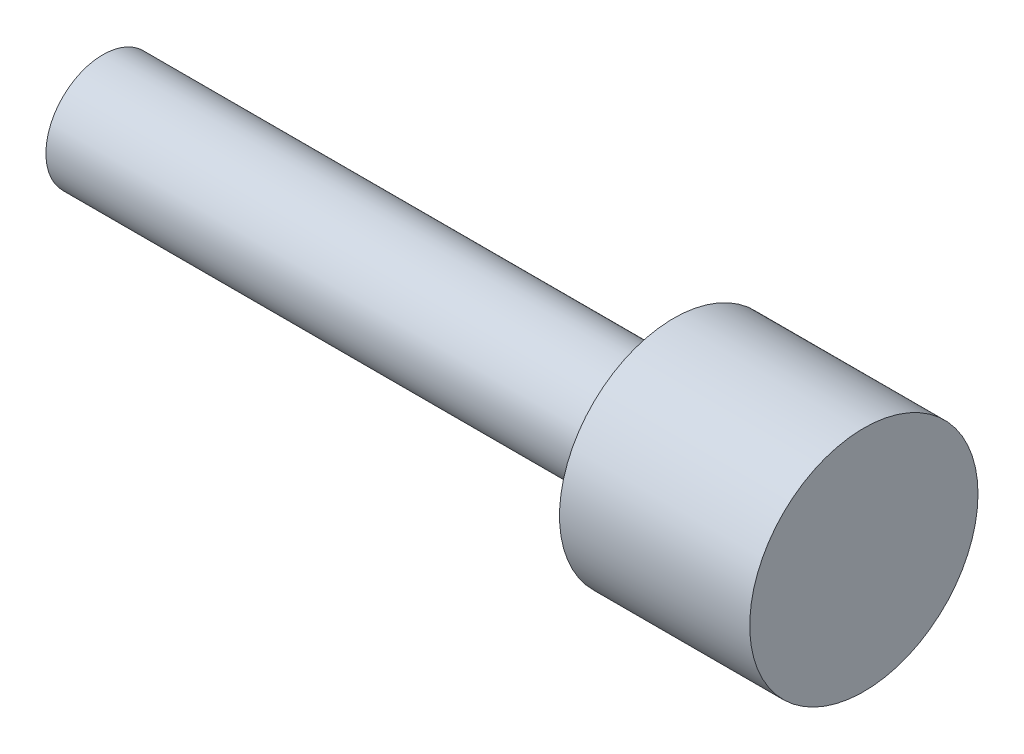
ISO-10303-21;
HEADER;
FILE_DESCRIPTION(('STEP AP214'),'2;1');
FILE_NAME('part.step','',(''),(''),'','','');
FILE_SCHEMA(('AUTOMOTIVE_DESIGN { 1 0 10303 214 1 1 1 1 }'));
ENDSEC;
DATA;
#1=APPLICATION_CONTEXT('core data for automotive mechanical design processes');
#2=APPLICATION_PROTOCOL_DEFINITION('international standard','automotive_design',2000,#1);
#3=PRODUCT_CONTEXT('',#1,'mechanical');
#4=PRODUCT('Part','Part','',(#3));
#5=PRODUCT_RELATED_PRODUCT_CATEGORY('part','',(#4));
#6=PRODUCT_DEFINITION_FORMATION('','',#4);
#7=PRODUCT_DEFINITION_CONTEXT('part definition',#1,'design');
#8=PRODUCT_DEFINITION('design','',#6,#7);
#9=PRODUCT_DEFINITION_SHAPE('','',#8);
#10=(LENGTH_UNIT() NAMED_UNIT(*) SI_UNIT(.MILLI.,.METRE.));
#11=(NAMED_UNIT(*) PLANE_ANGLE_UNIT() SI_UNIT($,.RADIAN.));
#12=(NAMED_UNIT(*) SI_UNIT($,.STERADIAN.) SOLID_ANGLE_UNIT());
#13=UNCERTAINTY_MEASURE_WITH_UNIT(LENGTH_MEASURE(1.E-05),#10,'distance_accuracy_value','');
#14=(GEOMETRIC_REPRESENTATION_CONTEXT(3) GLOBAL_UNCERTAINTY_ASSIGNED_CONTEXT((#13)) GLOBAL_UNIT_ASSIGNED_CONTEXT((#10,
#11,#12)) REPRESENTATION_CONTEXT('',''));
#15=CARTESIAN_POINT('',(0.,0.,0.));
#16=DIRECTION('',(0.,0.,1.));
#17=DIRECTION('',(1.,0.,0.));
#18=AXIS2_PLACEMENT_3D('',#15,#16,#17);
#19=CARTESIAN_POINT('',(0.,0.,0.));
#20=DIRECTION('',(-1.,0.,0.));
#21=DIRECTION('',(0.,0.,1.));
#22=AXIS2_PLACEMENT_3D('',#19,#20,#21);
#23=PLANE('',#22);
#24=CARTESIAN_POINT('',(0.,0.,0.));
#25=DIRECTION('',(1.,0.,0.));
#26=DIRECTION('',(0.,0.,-1.));
#27=AXIS2_PLACEMENT_3D('',#24,#25,#26);
#28=CIRCLE('',#27,3.);
#29=CARTESIAN_POINT('',(0.,0.,-3.));
#30=VERTEX_POINT('',#29);
#31=EDGE_CURVE('E10',#30,#30,#28,.T.);
#32=ORIENTED_EDGE('',*,*,#31,.F.);
#33=EDGE_LOOP('',(#32));
#34=FACE_BOUND('',#33,.T.);
#35=ADVANCED_FACE('F31',(#34),#23,.T.);
#36=CARTESIAN_POINT('',(40.,0.,0.));
#37=DIRECTION('',(1.,0.,0.));
#38=DIRECTION('',(0.,0.,-1.));
#39=AXIS2_PLACEMENT_3D('',#36,#37,#38);
#40=CYLINDRICAL_SURFACE('',#39,3.);
#41=ORIENTED_EDGE('',*,*,#31,.T.);
#42=EDGE_LOOP('',(#41));
#43=FACE_BOUND('',#42,.T.);
#44=CARTESIAN_POINT('',(30.,0.,0.));
#45=DIRECTION('',(1.,0.,0.));
#46=DIRECTION('',(0.,0.,-1.));
#47=AXIS2_PLACEMENT_3D('',#44,#45,#46);
#48=CIRCLE('',#47,3.);
#49=CARTESIAN_POINT('',(30.,0.,-3.));
#50=VERTEX_POINT('',#49);
#51=EDGE_CURVE('E37',#50,#50,#48,.T.);
#52=ORIENTED_EDGE('',*,*,#51,.F.);
#53=EDGE_LOOP('',(#52));
#54=FACE_BOUND('',#53,.T.);
#55=ADVANCED_FACE('F63',(#43,#54),#40,.T.);
#56=CARTESIAN_POINT('',(30.,3.,0.));
#57=DIRECTION('',(-1.,0.,0.));
#58=DIRECTION('',(0.,0.,1.));
#59=AXIS2_PLACEMENT_3D('',#56,#57,#58);
#60=PLANE('',#59);
#61=ORIENTED_EDGE('',*,*,#51,.T.);
#62=EDGE_LOOP('',(#61));
#63=FACE_BOUND('',#62,.T.);
#64=CARTESIAN_POINT('',(30.,0.,0.));
#65=DIRECTION('',(1.,0.,0.));
#66=DIRECTION('',(0.,0.,-1.));
#67=AXIS2_PLACEMENT_3D('',#64,#65,#66);
#68=CIRCLE('',#67,6.);
#69=CARTESIAN_POINT('',(30.,0.,-6.));
#70=VERTEX_POINT('',#69);
#71=EDGE_CURVE('E41',#70,#70,#68,.T.);
#72=ORIENTED_EDGE('',*,*,#71,.F.);
#73=EDGE_LOOP('',(#72));
#74=FACE_BOUND('',#73,.T.);
#75=ADVANCED_FACE('F55',(#63,#74),#60,.T.);
#76=CARTESIAN_POINT('',(40.,0.,0.));
#77=DIRECTION('',(1.,0.,0.));
#78=DIRECTION('',(0.,0.,-1.));
#79=AXIS2_PLACEMENT_3D('',#76,#77,#78);
#80=CYLINDRICAL_SURFACE('',#79,6.);
#81=ORIENTED_EDGE('',*,*,#71,.T.);
#82=EDGE_LOOP('',(#81));
#83=FACE_BOUND('',#82,.T.);
#84=CARTESIAN_POINT('',(40.,0.,0.));
#85=DIRECTION('',(1.,0.,0.));
#86=DIRECTION('',(0.,0.,-1.));
#87=AXIS2_PLACEMENT_3D('',#84,#85,#86);
#88=CIRCLE('',#87,6.);
#89=CARTESIAN_POINT('',(40.,0.,-6.));
#90=VERTEX_POINT('',#89);
#91=EDGE_CURVE('E45',#90,#90,#88,.T.);
#92=ORIENTED_EDGE('',*,*,#91,.F.);
#93=EDGE_LOOP('',(#92));
#94=FACE_BOUND('',#93,.T.);
#95=ADVANCED_FACE('F53',(#83,#94),#80,.T.);
#96=CARTESIAN_POINT('',(40.,6.,0.));
#97=DIRECTION('',(1.,0.,0.));
#98=DIRECTION('',(0.,0.,-1.));
#99=AXIS2_PLACEMENT_3D('',#96,#97,#98);
#100=PLANE('',#99);
#101=ORIENTED_EDGE('',*,*,#91,.T.);
#102=EDGE_LOOP('',(#101));
#103=FACE_BOUND('',#102,.T.);
#104=ADVANCED_FACE('F51',(#103),#100,.T.);
#105=CLOSED_SHELL('',(#35,#55,#75,#95,#104));
#106=MANIFOLD_SOLID_BREP('B2',#105);
#107=ADVANCED_BREP_SHAPE_REPRESENTATION('',(#18,#106),#14);
#108=SHAPE_DEFINITION_REPRESENTATION(#9,#107);
ENDSEC;
END-ISO-10303-21;
